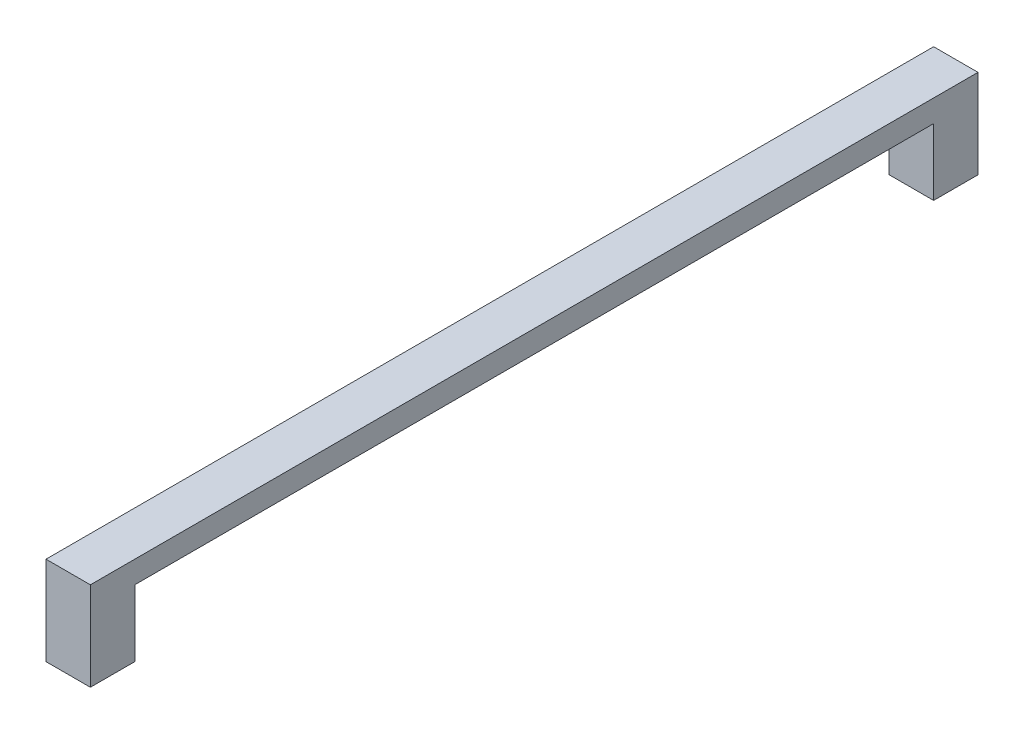
ISO-10303-21;
HEADER;
FILE_DESCRIPTION(('STEP AP214'),'2;1');
FILE_NAME('part.step','',(''),(''),'','','');
FILE_SCHEMA(('AUTOMOTIVE_DESIGN { 1 0 10303 214 1 1 1 1 }'));
ENDSEC;
DATA;
#1=APPLICATION_CONTEXT('core data for automotive mechanical design processes');
#2=APPLICATION_PROTOCOL_DEFINITION('international standard','automotive_design',2000,#1);
#3=PRODUCT_CONTEXT('',#1,'mechanical');
#4=PRODUCT('Part','Part','',(#3));
#5=PRODUCT_RELATED_PRODUCT_CATEGORY('part','',(#4));
#6=PRODUCT_DEFINITION_FORMATION('','',#4);
#7=PRODUCT_DEFINITION_CONTEXT('part definition',#1,'design');
#8=PRODUCT_DEFINITION('design','',#6,#7);
#9=PRODUCT_DEFINITION_SHAPE('','',#8);
#10=(LENGTH_UNIT() NAMED_UNIT(*) SI_UNIT(.MILLI.,.METRE.));
#11=(NAMED_UNIT(*) PLANE_ANGLE_UNIT() SI_UNIT($,.RADIAN.));
#12=(NAMED_UNIT(*) SI_UNIT($,.STERADIAN.) SOLID_ANGLE_UNIT());
#13=UNCERTAINTY_MEASURE_WITH_UNIT(LENGTH_MEASURE(1.E-05),#10,'distance_accuracy_value','');
#14=(GEOMETRIC_REPRESENTATION_CONTEXT(3) GLOBAL_UNCERTAINTY_ASSIGNED_CONTEXT((#13)) GLOBAL_UNIT_ASSIGNED_CONTEXT((#10,
#11,#12)) REPRESENTATION_CONTEXT('',''));
#15=CARTESIAN_POINT('',(0.,0.,0.));
#16=DIRECTION('',(0.,0.,1.));
#17=DIRECTION('',(1.,0.,0.));
#18=AXIS2_PLACEMENT_3D('',#15,#16,#17);
#19=CARTESIAN_POINT('',(100.,-29.7115345465354,-1756.53739326925));
#20=DIRECTION('',(0.,0.,-1.));
#21=DIRECTION('',(-1.,0.,0.));
#22=AXIS2_PLACEMENT_3D('',#19,#20,#21);
#23=PLANE('',#22);
#24=DIRECTION('',(0.,-1.,0.));
#25=VECTOR('',#24,1.);
#26=CARTESIAN_POINT('',(0.,-29.7115345465354,-1756.53739326925));
#27=LINE('',#26,#25);
#28=CARTESIAN_POINT('',(0.,120.288465453465,-1756.53739326925));
#29=VERTEX_POINT('',#28);
#30=CARTESIAN_POINT('',(0.,-29.7115345465354,-1756.53739326925));
#31=VERTEX_POINT('',#30);
#32=EDGE_CURVE('E135',#29,#31,#27,.T.);
#33=ORIENTED_EDGE('',*,*,#32,.T.);
#34=DIRECTION('',(-1.,0.,0.));
#35=VECTOR('',#34,1.);
#36=CARTESIAN_POINT('',(100.,-29.7115345465354,-1756.53739326925));
#37=LINE('',#36,#35);
#38=CARTESIAN_POINT('',(100.,-29.7115345465354,-1756.53739326925));
#39=VERTEX_POINT('',#38);
#40=EDGE_CURVE('E11',#39,#31,#37,.T.);
#41=ORIENTED_EDGE('',*,*,#40,.F.);
#42=DIRECTION('',(0.,-1.,0.));
#43=VECTOR('',#42,1.);
#44=CARTESIAN_POINT('',(100.,-29.7115345465354,-1756.53739326925));
#45=LINE('',#44,#43);
#46=CARTESIAN_POINT('',(100.,120.288465453465,-1756.53739326925));
#47=VERTEX_POINT('',#46);
#48=EDGE_CURVE('E151',#47,#39,#45,.T.);
#49=ORIENTED_EDGE('',*,*,#48,.F.);
#50=DIRECTION('',(-1.,0.,0.));
#51=VECTOR('',#50,1.);
#52=CARTESIAN_POINT('',(100.,120.288465453465,-1756.53739326925));
#53=LINE('',#52,#51);
#54=EDGE_CURVE('E131',#47,#29,#53,.T.);
#55=ORIENTED_EDGE('',*,*,#54,.T.);
#56=EDGE_LOOP('',(#33,#41,#49,#55));
#57=FACE_BOUND('',#56,.T.);
#58=ADVANCED_FACE('F39',(#57),#23,.F.);
#59=CARTESIAN_POINT('',(100.,-29.7115345465354,-1856.53739326925));
#60=DIRECTION('',(0.,1.,0.));
#61=DIRECTION('',(0.,0.,1.));
#62=AXIS2_PLACEMENT_3D('',#59,#60,#61);
#63=PLANE('',#62);
#64=DIRECTION('',(0.,0.,-1.));
#65=VECTOR('',#64,1.);
#66=CARTESIAN_POINT('',(0.,-29.7115345465354,-1856.53739326925));
#67=LINE('',#66,#65);
#68=CARTESIAN_POINT('',(0.,-29.7115345465354,-1856.53739326925));
#69=VERTEX_POINT('',#68);
#70=EDGE_CURVE('E138',#31,#69,#67,.T.);
#71=ORIENTED_EDGE('',*,*,#70,.T.);
#72=DIRECTION('',(-1.,0.,0.));
#73=VECTOR('',#72,1.);
#74=CARTESIAN_POINT('',(100.,-29.7115345465354,-1856.53739326925));
#75=LINE('',#74,#73);
#76=CARTESIAN_POINT('',(100.,-29.7115345465354,-1856.53739326925));
#77=VERTEX_POINT('',#76);
#78=EDGE_CURVE('E47',#77,#69,#75,.T.);
#79=ORIENTED_EDGE('',*,*,#78,.F.);
#80=DIRECTION('',(0.,0.,-1.));
#81=VECTOR('',#80,1.);
#82=CARTESIAN_POINT('',(100.,-29.7115345465354,-1856.53739326925));
#83=LINE('',#82,#81);
#84=EDGE_CURVE('E98',#39,#77,#83,.T.);
#85=ORIENTED_EDGE('',*,*,#84,.F.);
#86=ORIENTED_EDGE('',*,*,#40,.T.);
#87=EDGE_LOOP('',(#71,#79,#85,#86));
#88=FACE_BOUND('',#87,.T.);
#89=ADVANCED_FACE('F166',(#88),#63,.F.);
#90=CARTESIAN_POINT('',(100.,120.288465453465,-1856.53739326925));
#91=DIRECTION('',(0.,0.,1.));
#92=DIRECTION('',(1.,0.,0.));
#93=AXIS2_PLACEMENT_3D('',#90,#91,#92);
#94=PLANE('',#93);
#95=DIRECTION('',(0.,1.,0.));
#96=VECTOR('',#95,1.);
#97=CARTESIAN_POINT('',(0.,120.288465453465,-1856.53739326925));
#98=LINE('',#97,#96);
#99=CARTESIAN_POINT('',(0.,170.288465453465,-1856.53739326925));
#100=VERTEX_POINT('',#99);
#101=EDGE_CURVE('E141',#69,#100,#98,.T.);
#102=ORIENTED_EDGE('',*,*,#101,.T.);
#103=DIRECTION('',(-1.,0.,0.));
#104=VECTOR('',#103,1.);
#105=CARTESIAN_POINT('',(100.,170.288465453465,-1856.53739326925));
#106=LINE('',#105,#104);
#107=CARTESIAN_POINT('',(100.,170.288465453465,-1856.53739326925));
#108=VERTEX_POINT('',#107);
#109=EDGE_CURVE('E158',#108,#100,#106,.T.);
#110=ORIENTED_EDGE('',*,*,#109,.F.);
#111=DIRECTION('',(0.,1.,0.));
#112=VECTOR('',#111,1.);
#113=CARTESIAN_POINT('',(100.,120.288465453465,-1856.53739326925));
#114=LINE('',#113,#112);
#115=EDGE_CURVE('E165',#77,#108,#114,.T.);
#116=ORIENTED_EDGE('',*,*,#115,.F.);
#117=ORIENTED_EDGE('',*,*,#78,.T.);
#118=EDGE_LOOP('',(#102,#110,#116,#117));
#119=FACE_BOUND('',#118,.T.);
#120=ADVANCED_FACE('F163',(#119),#94,.F.);
#121=CARTESIAN_POINT('',(100.,170.288465453464,143.462606730751));
#122=DIRECTION('',(0.,-1.,0.));
#123=DIRECTION('',(0.,0.,-1.));
#124=AXIS2_PLACEMENT_3D('',#121,#122,#123);
#125=PLANE('',#124);
#126=DIRECTION('',(0.,0.,1.));
#127=VECTOR('',#126,1.);
#128=CARTESIAN_POINT('',(0.,170.288465453464,143.462606730751));
#129=LINE('',#128,#127);
#130=CARTESIAN_POINT('',(0.,170.288465453464,143.462606730751));
#131=VERTEX_POINT('',#130);
#132=EDGE_CURVE('E143',#100,#131,#129,.T.);
#133=ORIENTED_EDGE('',*,*,#132,.T.);
#134=DIRECTION('',(-1.,0.,0.));
#135=VECTOR('',#134,1.);
#136=CARTESIAN_POINT('',(100.,170.288465453464,143.462606730751));
#137=LINE('',#136,#135);
#138=CARTESIAN_POINT('',(100.,170.288465453464,143.462606730751));
#139=VERTEX_POINT('',#138);
#140=EDGE_CURVE('E155',#139,#131,#137,.T.);
#141=ORIENTED_EDGE('',*,*,#140,.F.);
#142=DIRECTION('',(0.,0.,1.));
#143=VECTOR('',#142,1.);
#144=CARTESIAN_POINT('',(100.,170.288465453464,143.462606730751));
#145=LINE('',#144,#143);
#146=EDGE_CURVE('E178',#108,#139,#145,.T.);
#147=ORIENTED_EDGE('',*,*,#146,.F.);
#148=ORIENTED_EDGE('',*,*,#109,.T.);
#149=EDGE_LOOP('',(#133,#141,#147,#148));
#150=FACE_BOUND('',#149,.T.);
#151=ADVANCED_FACE('F174',(#150),#125,.F.);
#152=CARTESIAN_POINT('',(100.,120.288465453464,143.462606730751));
#153=DIRECTION('',(0.,0.,-1.));
#154=DIRECTION('',(0.,1.,0.));
#155=AXIS2_PLACEMENT_3D('',#152,#153,#154);
#156=PLANE('',#155);
#157=DIRECTION('',(0.,-1.,0.));
#158=VECTOR('',#157,1.);
#159=CARTESIAN_POINT('',(0.,120.288465453464,143.462606730751));
#160=LINE('',#159,#158);
#161=CARTESIAN_POINT('',(0.,-29.7115345465356,143.462606730751));
#162=VERTEX_POINT('',#161);
#163=EDGE_CURVE('E146',#131,#162,#160,.T.);
#164=ORIENTED_EDGE('',*,*,#163,.T.);
#165=DIRECTION('',(-1.,0.,0.));
#166=VECTOR('',#165,1.);
#167=CARTESIAN_POINT('',(100.,-29.7115345465356,143.462606730751));
#168=LINE('',#167,#166);
#169=CARTESIAN_POINT('',(100.,-29.7115345465356,143.462606730751));
#170=VERTEX_POINT('',#169);
#171=EDGE_CURVE('E126',#170,#162,#168,.T.);
#172=ORIENTED_EDGE('',*,*,#171,.F.);
#173=DIRECTION('',(0.,-1.,0.));
#174=VECTOR('',#173,1.);
#175=CARTESIAN_POINT('',(100.,120.288465453464,143.462606730751));
#176=LINE('',#175,#174);
#177=EDGE_CURVE('E117',#139,#170,#176,.T.);
#178=ORIENTED_EDGE('',*,*,#177,.F.);
#179=ORIENTED_EDGE('',*,*,#140,.T.);
#180=EDGE_LOOP('',(#164,#172,#178,#179));
#181=FACE_BOUND('',#180,.T.);
#182=ADVANCED_FACE('F177',(#181),#156,.F.);
#183=CARTESIAN_POINT('',(100.,-29.7115345465356,143.462606730751));
#184=DIRECTION('',(0.,1.,0.));
#185=DIRECTION('',(0.,0.,1.));
#186=AXIS2_PLACEMENT_3D('',#183,#184,#185);
#187=PLANE('',#186);
#188=DIRECTION('',(0.,0.,-1.));
#189=VECTOR('',#188,1.);
#190=CARTESIAN_POINT('',(0.,-29.7115345465356,143.462606730751));
#191=LINE('',#190,#189);
#192=CARTESIAN_POINT('',(0.,-29.7115345465356,43.4626067307514));
#193=VERTEX_POINT('',#192);
#194=EDGE_CURVE('E125',#162,#193,#191,.T.);
#195=ORIENTED_EDGE('',*,*,#194,.T.);
#196=DIRECTION('',(-1.,0.,0.));
#197=VECTOR('',#196,1.);
#198=CARTESIAN_POINT('',(100.,-29.7115345465356,43.4626067307514));
#199=LINE('',#198,#197);
#200=CARTESIAN_POINT('',(100.,-29.7115345465356,43.4626067307514));
#201=VERTEX_POINT('',#200);
#202=EDGE_CURVE('E122',#201,#193,#199,.T.);
#203=ORIENTED_EDGE('',*,*,#202,.F.);
#204=DIRECTION('',(0.,0.,-1.));
#205=VECTOR('',#204,1.);
#206=CARTESIAN_POINT('',(100.,-29.7115345465356,143.462606730751));
#207=LINE('',#206,#205);
#208=EDGE_CURVE('E111',#170,#201,#207,.T.);
#209=ORIENTED_EDGE('',*,*,#208,.F.);
#210=ORIENTED_EDGE('',*,*,#171,.T.);
#211=EDGE_LOOP('',(#195,#203,#209,#210));
#212=FACE_BOUND('',#211,.T.);
#213=ADVANCED_FACE('F123',(#212),#187,.F.);
#214=CARTESIAN_POINT('',(100.,-29.7115345465356,43.4626067307514));
#215=DIRECTION('',(0.,0.,1.));
#216=DIRECTION('',(1.,0.,0.));
#217=AXIS2_PLACEMENT_3D('',#214,#215,#216);
#218=PLANE('',#217);
#219=DIRECTION('',(0.,1.,0.));
#220=VECTOR('',#219,1.);
#221=CARTESIAN_POINT('',(0.,-29.7115345465356,43.4626067307514));
#222=LINE('',#221,#220);
#223=CARTESIAN_POINT('',(0.,120.288465453464,43.4626067307514));
#224=VERTEX_POINT('',#223);
#225=EDGE_CURVE('E84',#193,#224,#222,.T.);
#226=ORIENTED_EDGE('',*,*,#225,.T.);
#227=DIRECTION('',(-1.,0.,0.));
#228=VECTOR('',#227,1.);
#229=CARTESIAN_POINT('',(100.,120.288465453464,43.4626067307514));
#230=LINE('',#229,#228);
#231=CARTESIAN_POINT('',(100.,120.288465453464,43.4626067307514));
#232=VERTEX_POINT('',#231);
#233=EDGE_CURVE('E127',#232,#224,#230,.T.);
#234=ORIENTED_EDGE('',*,*,#233,.F.);
#235=DIRECTION('',(0.,1.,0.));
#236=VECTOR('',#235,1.);
#237=CARTESIAN_POINT('',(100.,-29.7115345465356,43.4626067307514));
#238=LINE('',#237,#236);
#239=EDGE_CURVE('E115',#201,#232,#238,.T.);
#240=ORIENTED_EDGE('',*,*,#239,.F.);
#241=ORIENTED_EDGE('',*,*,#202,.T.);
#242=EDGE_LOOP('',(#226,#234,#240,#241));
#243=FACE_BOUND('',#242,.T.);
#244=ADVANCED_FACE('F129',(#243),#218,.F.);
#245=CARTESIAN_POINT('',(100.,120.288465453464,43.4626067307514));
#246=DIRECTION('',(0.,1.,0.));
#247=DIRECTION('',(0.,0.,1.));
#248=AXIS2_PLACEMENT_3D('',#245,#246,#247);
#249=PLANE('',#248);
#250=DIRECTION('',(0.,0.,-1.));
#251=VECTOR('',#250,1.);
#252=CARTESIAN_POINT('',(0.,120.288465453464,43.4626067307514));
#253=LINE('',#252,#251);
#254=EDGE_CURVE('E90',#224,#29,#253,.T.);
#255=ORIENTED_EDGE('',*,*,#254,.T.);
#256=ORIENTED_EDGE('',*,*,#54,.F.);
#257=DIRECTION('',(0.,0.,-1.));
#258=VECTOR('',#257,1.);
#259=CARTESIAN_POINT('',(100.,120.288465453464,43.4626067307514));
#260=LINE('',#259,#258);
#261=EDGE_CURVE('E55',#232,#47,#260,.T.);
#262=ORIENTED_EDGE('',*,*,#261,.F.);
#263=ORIENTED_EDGE('',*,*,#233,.T.);
#264=EDGE_LOOP('',(#255,#256,#262,#263));
#265=FACE_BOUND('',#264,.T.);
#266=ADVANCED_FACE('F185',(#265),#249,.F.);
#267=CARTESIAN_POINT('',(100.,0.,0.));
#268=DIRECTION('',(-1.,0.,0.));
#269=DIRECTION('',(0.,0.,1.));
#270=AXIS2_PLACEMENT_3D('',#267,#268,#269);
#271=PLANE('',#270);
#272=ORIENTED_EDGE('',*,*,#48,.T.);
#273=ORIENTED_EDGE('',*,*,#84,.T.);
#274=ORIENTED_EDGE('',*,*,#115,.T.);
#275=ORIENTED_EDGE('',*,*,#146,.T.);
#276=ORIENTED_EDGE('',*,*,#177,.T.);
#277=ORIENTED_EDGE('',*,*,#208,.T.);
#278=ORIENTED_EDGE('',*,*,#239,.T.);
#279=ORIENTED_EDGE('',*,*,#261,.T.);
#280=EDGE_LOOP('',(#272,#273,#274,#275,#276,#277,#278,#279));
#281=FACE_BOUND('',#280,.T.);
#282=ADVANCED_FACE('F113',(#281),#271,.F.);
#283=CARTESIAN_POINT('',(0.,0.,0.));
#284=DIRECTION('',(-1.,0.,0.));
#285=DIRECTION('',(0.,0.,1.));
#286=AXIS2_PLACEMENT_3D('',#283,#284,#285);
#287=PLANE('',#286);
#288=ORIENTED_EDGE('',*,*,#32,.F.);
#289=ORIENTED_EDGE('',*,*,#254,.F.);
#290=ORIENTED_EDGE('',*,*,#225,.F.);
#291=ORIENTED_EDGE('',*,*,#194,.F.);
#292=ORIENTED_EDGE('',*,*,#163,.F.);
#293=ORIENTED_EDGE('',*,*,#132,.F.);
#294=ORIENTED_EDGE('',*,*,#101,.F.);
#295=ORIENTED_EDGE('',*,*,#70,.F.);
#296=EDGE_LOOP('',(#288,#289,#290,#291,#292,#293,#294,#295));
#297=FACE_BOUND('',#296,.T.);
#298=ADVANCED_FACE('F170',(#297),#287,.T.);
#299=CLOSED_SHELL('',(#58,#89,#120,#151,#182,#213,#244,#266,#282,#298));
#300=MANIFOLD_SOLID_BREP('B2',#299);
#301=ADVANCED_BREP_SHAPE_REPRESENTATION('',(#18,#300),#14);
#302=SHAPE_DEFINITION_REPRESENTATION(#9,#301);
ENDSEC;
END-ISO-10303-21;
